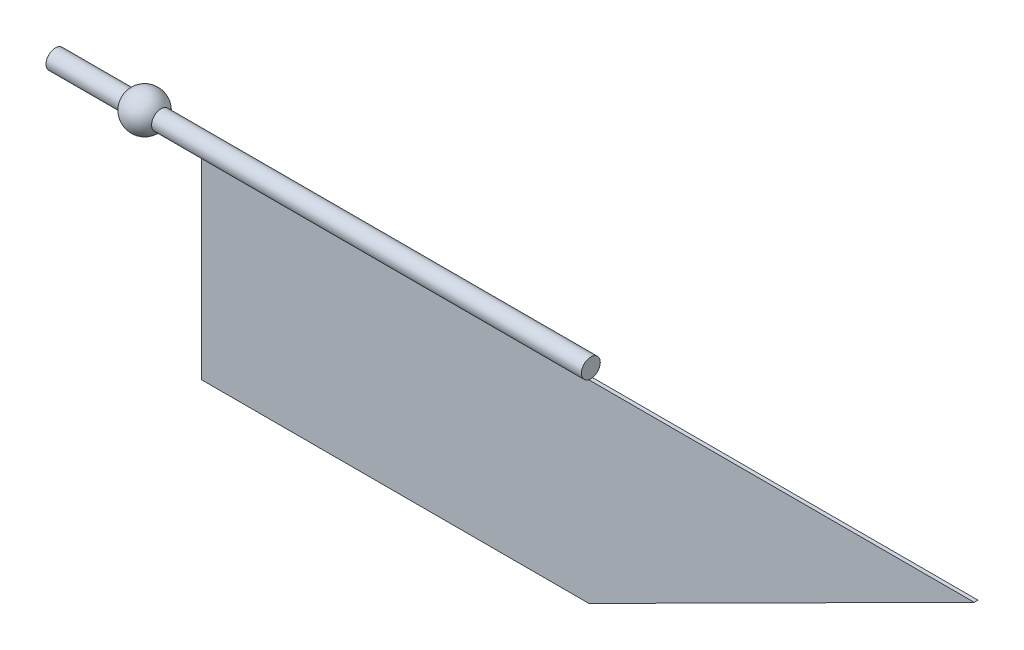
ISO-10303-21;
HEADER;
FILE_DESCRIPTION(('STEP AP214'),'2;1');
FILE_NAME('part.step','',(''),(''),'','','');
FILE_SCHEMA(('AUTOMOTIVE_DESIGN { 1 0 10303 214 1 1 1 1 }'));
ENDSEC;
DATA;
#1=APPLICATION_CONTEXT('core data for automotive mechanical design processes');
#2=APPLICATION_PROTOCOL_DEFINITION('international standard','automotive_design',2000,#1);
#3=PRODUCT_CONTEXT('',#1,'mechanical');
#4=PRODUCT('Part','Part','',(#3));
#5=PRODUCT_RELATED_PRODUCT_CATEGORY('part','',(#4));
#6=PRODUCT_DEFINITION_FORMATION('','',#4);
#7=PRODUCT_DEFINITION_CONTEXT('part definition',#1,'design');
#8=PRODUCT_DEFINITION('design','',#6,#7);
#9=PRODUCT_DEFINITION_SHAPE('','',#8);
#10=(LENGTH_UNIT() NAMED_UNIT(*) SI_UNIT(.MILLI.,.METRE.));
#11=(NAMED_UNIT(*) PLANE_ANGLE_UNIT() SI_UNIT($,.RADIAN.));
#12=(NAMED_UNIT(*) SI_UNIT($,.STERADIAN.) SOLID_ANGLE_UNIT());
#13=UNCERTAINTY_MEASURE_WITH_UNIT(LENGTH_MEASURE(1.E-05),#10,'distance_accuracy_value','');
#14=(GEOMETRIC_REPRESENTATION_CONTEXT(3) GLOBAL_UNCERTAINTY_ASSIGNED_CONTEXT((#13)) GLOBAL_UNIT_ASSIGNED_CONTEXT((#10,
#11,#12)) REPRESENTATION_CONTEXT('',''));
#15=CARTESIAN_POINT('',(0.,0.,0.));
#16=DIRECTION('',(0.,0.,1.));
#17=DIRECTION('',(1.,0.,0.));
#18=AXIS2_PLACEMENT_3D('',#15,#16,#17);
#19=CARTESIAN_POINT('',(12.4607692051384,-24.7953276156456,0.127));
#20=DIRECTION('',(-0.449031905592181,0.893515723286532,0.));
#21=DIRECTION('',(-0.893515723286532,-0.449031905592181,0.));
#22=AXIS2_PLACEMENT_3D('',#19,#20,#21);
#23=PLANE('',#22);
#24=DIRECTION('',(0.893515723286532,0.449031905592181,0.));
#25=VECTOR('',#24,1.);
#26=CARTESIAN_POINT('',(12.4607692051384,-24.7953276156456,-0.127));
#27=LINE('',#26,#25);
#28=CARTESIAN_POINT('',(35.9365149650358,-12.9977077427786,-0.127));
#29=VERTEX_POINT('',#28);
#30=CARTESIAN_POINT('',(61.8002811923816,0.,-0.127));
#31=VERTEX_POINT('',#30);
#32=EDGE_CURVE('E111',#29,#31,#27,.T.);
#33=ORIENTED_EDGE('',*,*,#32,.T.);
#34=DIRECTION('',(0.,0.,-1.));
#35=VECTOR('',#34,1.);
#36=CARTESIAN_POINT('',(61.8002811923816,0.,0.127));
#37=LINE('',#36,#35);
#38=CARTESIAN_POINT('',(61.8002811923816,0.,0.127));
#39=VERTEX_POINT('',#38);
#40=EDGE_CURVE('E12',#39,#31,#37,.T.);
#41=ORIENTED_EDGE('',*,*,#40,.F.);
#42=DIRECTION('',(0.893515723286532,0.449031905592181,0.));
#43=VECTOR('',#42,1.);
#44=CARTESIAN_POINT('',(12.4607692051384,-24.7953276156456,0.127));
#45=LINE('',#44,#43);
#46=CARTESIAN_POINT('',(35.9365149650358,-12.9977077427786,0.127));
#47=VERTEX_POINT('',#46);
#48=EDGE_CURVE('E105',#47,#39,#45,.T.);
#49=ORIENTED_EDGE('',*,*,#48,.F.);
#50=DIRECTION('',(0.,0.,-1.));
#51=VECTOR('',#50,1.);
#52=CARTESIAN_POINT('',(35.9365149650358,-12.9977077427786,0.127));
#53=LINE('',#52,#51);
#54=EDGE_CURVE('E109',#47,#29,#53,.T.);
#55=ORIENTED_EDGE('',*,*,#54,.T.);
#56=EDGE_LOOP('',(#33,#41,#49,#55));
#57=FACE_BOUND('',#56,.T.);
#58=ADVANCED_FACE('F51',(#57),#23,.F.);
#59=CARTESIAN_POINT('',(0.,0.,0.127));
#60=DIRECTION('',(0.,-1.,0.));
#61=DIRECTION('',(0.,0.,-1.));
#62=AXIS2_PLACEMENT_3D('',#59,#60,#61);
#63=PLANE('',#62);
#64=DIRECTION('',(-1.,0.,0.));
#65=VECTOR('',#64,1.);
#66=CARTESIAN_POINT('',(0.,0.,-0.127));
#67=LINE('',#66,#65);
#68=CARTESIAN_POINT('',(9.92121977920196,0.,-0.127));
#69=VERTEX_POINT('',#68);
#70=EDGE_CURVE('E106',#31,#69,#67,.T.);
#71=ORIENTED_EDGE('',*,*,#70,.T.);
#72=DIRECTION('',(0.,0.,-1.));
#73=VECTOR('',#72,1.);
#74=CARTESIAN_POINT('',(9.92121977920196,0.,0.127));
#75=LINE('',#74,#73);
#76=CARTESIAN_POINT('',(9.92121977920196,0.,0.127));
#77=VERTEX_POINT('',#76);
#78=EDGE_CURVE('E56',#77,#69,#75,.T.);
#79=ORIENTED_EDGE('',*,*,#78,.F.);
#80=DIRECTION('',(-1.,0.,0.));
#81=VECTOR('',#80,1.);
#82=CARTESIAN_POINT('',(0.,0.,0.127));
#83=LINE('',#82,#81);
#84=EDGE_CURVE('E100',#39,#77,#83,.T.);
#85=ORIENTED_EDGE('',*,*,#84,.F.);
#86=ORIENTED_EDGE('',*,*,#40,.T.);
#87=EDGE_LOOP('',(#71,#79,#85,#86));
#88=FACE_BOUND('',#87,.T.);
#89=ADVANCED_FACE('F104',(#88),#63,.F.);
#90=CARTESIAN_POINT('',(9.92121977920196,0.,0.127));
#91=DIRECTION('',(1.,0.,0.));
#92=DIRECTION('',(0.,0.,-1.));
#93=AXIS2_PLACEMENT_3D('',#90,#91,#92);
#94=PLANE('',#93);
#95=DIRECTION('',(0.,-1.,0.));
#96=VECTOR('',#95,1.);
#97=CARTESIAN_POINT('',(9.92121977920196,0.,-0.127));
#98=LINE('',#97,#96);
#99=CARTESIAN_POINT('',(9.92121977920196,-12.9977077427786,-0.127));
#100=VERTEX_POINT('',#99);
#101=EDGE_CURVE('E82',#69,#100,#98,.T.);
#102=ORIENTED_EDGE('',*,*,#101,.T.);
#103=DIRECTION('',(0.,0.,-1.));
#104=VECTOR('',#103,1.);
#105=CARTESIAN_POINT('',(9.92121977920196,-12.9977077427786,0.127));
#106=LINE('',#105,#104);
#107=CARTESIAN_POINT('',(9.92121977920196,-12.9977077427786,0.127));
#108=VERTEX_POINT('',#107);
#109=EDGE_CURVE('E110',#108,#100,#106,.T.);
#110=ORIENTED_EDGE('',*,*,#109,.F.);
#111=DIRECTION('',(0.,-1.,0.));
#112=VECTOR('',#111,1.);
#113=CARTESIAN_POINT('',(9.92121977920196,0.,0.127));
#114=LINE('',#113,#112);
#115=EDGE_CURVE('E99',#77,#108,#114,.T.);
#116=ORIENTED_EDGE('',*,*,#115,.F.);
#117=ORIENTED_EDGE('',*,*,#78,.T.);
#118=EDGE_LOOP('',(#102,#110,#116,#117));
#119=FACE_BOUND('',#118,.T.);
#120=ADVANCED_FACE('F107',(#119),#94,.F.);
#121=CARTESIAN_POINT('',(0.,-12.9977077427786,0.127));
#122=DIRECTION('',(0.,1.,0.));
#123=DIRECTION('',(0.,0.,1.));
#124=AXIS2_PLACEMENT_3D('',#121,#122,#123);
#125=PLANE('',#124);
#126=DIRECTION('',(1.,0.,0.));
#127=VECTOR('',#126,1.);
#128=CARTESIAN_POINT('',(0.,-12.9977077427786,-0.127));
#129=LINE('',#128,#127);
#130=EDGE_CURVE('E89',#100,#29,#129,.T.);
#131=ORIENTED_EDGE('',*,*,#130,.T.);
#132=ORIENTED_EDGE('',*,*,#54,.F.);
#133=DIRECTION('',(1.,0.,0.));
#134=VECTOR('',#133,1.);
#135=CARTESIAN_POINT('',(0.,-12.9977077427786,0.127));
#136=LINE('',#135,#134);
#137=EDGE_CURVE('E70',#108,#47,#136,.T.);
#138=ORIENTED_EDGE('',*,*,#137,.F.);
#139=ORIENTED_EDGE('',*,*,#109,.T.);
#140=EDGE_LOOP('',(#131,#132,#138,#139));
#141=FACE_BOUND('',#140,.T.);
#142=ADVANCED_FACE('F123',(#141),#125,.F.);
#143=CARTESIAN_POINT('',(0.,0.,0.127));
#144=DIRECTION('',(0.,0.,1.));
#145=DIRECTION('',(1.,0.,0.));
#146=AXIS2_PLACEMENT_3D('',#143,#144,#145);
#147=PLANE('',#146);
#148=ORIENTED_EDGE('',*,*,#48,.T.);
#149=ORIENTED_EDGE('',*,*,#84,.T.);
#150=ORIENTED_EDGE('',*,*,#115,.T.);
#151=ORIENTED_EDGE('',*,*,#137,.T.);
#152=EDGE_LOOP('',(#148,#149,#150,#151));
#153=FACE_BOUND('',#152,.T.);
#154=ADVANCED_FACE('F98',(#153),#147,.T.);
#155=CARTESIAN_POINT('',(0.,0.,-0.127));
#156=DIRECTION('',(0.,0.,1.));
#157=DIRECTION('',(1.,0.,0.));
#158=AXIS2_PLACEMENT_3D('',#155,#156,#157);
#159=PLANE('',#158);
#160=ORIENTED_EDGE('',*,*,#32,.F.);
#161=ORIENTED_EDGE('',*,*,#130,.F.);
#162=ORIENTED_EDGE('',*,*,#101,.F.);
#163=ORIENTED_EDGE('',*,*,#70,.F.);
#164=EDGE_LOOP('',(#160,#161,#162,#163));
#165=FACE_BOUND('',#164,.T.);
#166=ADVANCED_FACE('F122',(#165),#159,.F.);
#167=CLOSED_SHELL('',(#58,#89,#120,#142,#154,#166));
#168=MANIFOLD_SOLID_BREP('B2',#167);
#169=CARTESIAN_POINT('',(5.98668085653127,0.634999999999996,0.));
#170=DIRECTION('',(1.,0.,0.));
#171=DIRECTION('',(0.,-1.,0.));
#172=AXIS2_PLACEMENT_3D('',#169,#170,#171);
#173=SPHERICAL_SURFACE('',#172,1.27);
#174=CARTESIAN_POINT('',(4.88682859372503,0.634999999999996,0.));
#175=DIRECTION('',(1.,0.,0.));
#176=DIRECTION('',(0.,1.,0.));
#177=AXIS2_PLACEMENT_3D('',#174,#175,#176);
#178=CIRCLE('',#177,0.634999999999996);
#179=CARTESIAN_POINT('',(4.88682859372503,0.,0.));
#180=VERTEX_POINT('',#179);
#181=EDGE_CURVE('E196',#180,#180,#178,.T.);
#182=CARTESIAN_POINT('',(7.08653311933751,0.634999999999996,0.));
#183=DIRECTION('',(1.,0.,0.));
#184=DIRECTION('',(0.,1.,0.));
#185=AXIS2_PLACEMENT_3D('',#182,#183,#184);
#186=CIRCLE('',#185,0.634999999999996);
#187=CARTESIAN_POINT('',(7.08653311933751,0.,0.));
#188=VERTEX_POINT('',#187);
#189=EDGE_CURVE('E49',#188,#188,#186,.T.);
#190=CARTESIAN_POINT('',(4.88682859372503,0.,0.));
#191=CARTESIAN_POINT('',(4.90068098348725,-0.0239958265704566,0.));
#192=CARTESIAN_POINT('',(4.91532089867445,-0.0475367926717353,0.));
#193=CARTESIAN_POINT('',(4.94610799913962,-0.0936115991980544,0.));
#194=CARTESIAN_POINT('',(4.9622551844176,-0.116145439623095,0.));
#195=CARTESIAN_POINT('',(4.99598904430519,-0.160108590059057,0.));
#196=CARTESIAN_POINT('',(5.01357571891481,-0.181537900069978,0.));
#197=CARTESIAN_POINT('',(5.05011288315113,-0.223200470284199,0.));
#198=CARTESIAN_POINT('',(5.06906337277783,-0.2434337304875,0.));
#199=CARTESIAN_POINT('',(5.10824711607087,-0.282617493726334,0.));
#200=CARTESIAN_POINT('',(5.1284803697372,-0.301567996761867,0.));
#201=CARTESIAN_POINT('',(5.17014297297116,-0.338105114234739,0.));
#202=CARTESIAN_POINT('',(5.1915723225388,-0.355691728672077,0.));
#203=CARTESIAN_POINT('',(5.23553536084159,-0.389425755667665,0.));
#204=CARTESIAN_POINT('',(5.25806904957674,-0.405573168225913,0.));
#205=CARTESIAN_POINT('',(5.30414427161601,-0.436359647022557,0.));
#206=CARTESIAN_POINT('',(5.32768580492014,-0.450998713260952,0.));
#207=CARTESIAN_POINT('',(5.3756759081424,-0.478705812351528,0.));
#208=CARTESIAN_POINT('',(5.40012447806053,-0.49177384520371,0.));
#209=CARTESIAN_POINT('',(5.44982396184574,-0.516282918289325,0.));
#210=CARTESIAN_POINT('',(5.47507487571282,-0.527723958522758,0.));
#211=CARTESIAN_POINT('',(5.52627091914239,-0.548930054055918,0.));
#212=CARTESIAN_POINT('',(5.55221604870489,-0.558695109355645,0.));
#213=CARTESIAN_POINT('',(5.60468942248762,-0.576507419561931,0.));
#214=CARTESIAN_POINT('',(5.63121766670787,-0.584554674468489,0.));
#215=CARTESIAN_POINT('',(5.68474367179427,-0.598896924305752,0.));
#216=CARTESIAN_POINT('',(5.71174143266042,-0.605191919236456,0.));
#217=CARTESIAN_POINT('',(5.76609086248115,-0.616002692987757,0.));
#218=CARTESIAN_POINT('',(5.79344253143572,-0.620518471808354,0.));
#219=CARTESIAN_POINT('',(5.84838265338789,-0.627751476081132,0.));
#220=CARTESIAN_POINT('',(5.87597110638549,-0.630468701533313,0.));
#221=CARTESIAN_POINT('',(5.93126665843249,-0.634092963492749,0.));
#222=CARTESIAN_POINT('',(5.95897375748188,-0.635000000000004,0.));
#223=CARTESIAN_POINT('',(6.01438795558066,-0.635000000000004,0.));
#224=CARTESIAN_POINT('',(6.04209505463006,-0.634092963492749,0.));
#225=CARTESIAN_POINT('',(6.09739060667705,-0.630468701533313,0.));
#226=CARTESIAN_POINT('',(6.12497905967465,-0.627751476081132,0.));
#227=CARTESIAN_POINT('',(6.17991918162682,-0.620518471808354,0.));
#228=CARTESIAN_POINT('',(6.20727085058139,-0.616002692987757,0.));
#229=CARTESIAN_POINT('',(6.26162028040212,-0.605191919236456,0.));
#230=CARTESIAN_POINT('',(6.28861804126827,-0.598896924305751,0.));
#231=CARTESIAN_POINT('',(6.34214404635467,-0.584554674468489,0.));
#232=CARTESIAN_POINT('',(6.36867229057492,-0.57650741956193,0.));
#233=CARTESIAN_POINT('',(6.42114566435766,-0.558695109355644,0.));
#234=CARTESIAN_POINT('',(6.44709079392015,-0.548930054055917,0.));
#235=CARTESIAN_POINT('',(6.49828683734972,-0.527723958522757,0.));
#236=CARTESIAN_POINT('',(6.5235377512168,-0.516282918289324,0.));
#237=CARTESIAN_POINT('',(6.57323723500201,-0.491773845203709,0.));
#238=CARTESIAN_POINT('',(6.59768580492014,-0.478705812351527,0.));
#239=CARTESIAN_POINT('',(6.6456759081424,-0.450998713260951,0.));
#240=CARTESIAN_POINT('',(6.66921744144653,-0.436359647022556,0.));
#241=CARTESIAN_POINT('',(6.71529266348581,-0.405573168225912,0.));
#242=CARTESIAN_POINT('',(6.73782635222096,-0.389425755667663,0.));
#243=CARTESIAN_POINT('',(6.78178939052374,-0.355691728672076,0.));
#244=CARTESIAN_POINT('',(6.80321874009138,-0.338105114234738,0.));
#245=CARTESIAN_POINT('',(6.84488134332534,-0.301567996761866,0.));
#246=CARTESIAN_POINT('',(6.86511459699167,-0.282617493726332,0.));
#247=CARTESIAN_POINT('',(6.90429834028471,-0.243433730487498,0.));
#248=CARTESIAN_POINT('',(6.92324882991142,-0.223200470284198,0.));
#249=CARTESIAN_POINT('',(6.95978599414774,-0.181537900069976,0.));
#250=CARTESIAN_POINT('',(6.97737266875735,-0.160108590059055,0.));
#251=CARTESIAN_POINT('',(7.01110652864494,-0.116145439623093,0.));
#252=CARTESIAN_POINT('',(7.02725371392292,-0.0936115991980528,0.));
#253=CARTESIAN_POINT('',(7.05804081438809,-0.0475367926717337,0.));
#254=CARTESIAN_POINT('',(7.07268072957529,-0.0239958265704551,0.));
#255=CARTESIAN_POINT('',(7.08653311933751,0.,0.));
#256=B_SPLINE_CURVE_WITH_KNOTS('',3,(#190,#191,#192,#193,#194,#195,#196,#197,#198,#199,#200,
#201,#202,#203,#204,#205,#206,#207,#208,#209,#210,#211,#212,#213,#214,#215,#216,#217,#218,#219,
#220,#221,#222,#223,#224,#225,#226,#227,#228,#229,#230,#231,#232,#233,#234,#235,#236,#237,#238,
#239,#240,#241,#242,#243,#244,#245,#246,#247,#248,#249,#250,#251,#252,#253,#254,#255),
.UNSPECIFIED.,.F.,.F.,(4,2,2,2,2,2,2,2,2,2,2,2,2,2,2,2,2,2,2,2,2,2,2,2,2,2,2,2,2,2,2,2,4),(0.,
0.0831064703673118,0.166212940734624,0.249319411101935,0.332425881469247,0.415532351836559,
0.498638822203871,0.581745292571182,0.664851762938494,0.747958233305806,0.831064703673118,
0.914171174040429,0.997277644407741,1.08038411477505,1.16349058514237,1.24659705550968,
1.32970352587699,1.4128099962443,1.49591646661161,1.57902293697892,1.66212940734624,
1.74523587771355,1.82834234808086,1.91144881844817,1.99455528881548,2.0776617591828,
2.16076822955011,2.24387469991742,2.32698117028473,2.41008764065204,2.49319411101935,
2.57630058138667,2.65940705175398),.UNSPECIFIED.);
#257=EDGE_CURVE('BSEAM184',#180,#188,#256,.T.);
#258=ORIENTED_EDGE('',*,*,#181,.T.);
#259=ORIENTED_EDGE('',*,*,#189,.F.);
#260=ORIENTED_EDGE('',*,*,#257,.T.);
#261=ORIENTED_EDGE('',*,*,#257,.F.);
#262=EDGE_LOOP('',(#258,#260,#259,#261));
#263=FACE_BOUND('',#262,.T.);
#264=ADVANCED_FACE('F184',(#263),#173,.T.);
#265=CARTESIAN_POINT('',(35.9365149650358,0.635,0.));
#266=DIRECTION('',(1.,0.,0.));
#267=DIRECTION('',(0.,1.,0.));
#268=AXIS2_PLACEMENT_3D('',#265,#266,#267);
#269=CYLINDRICAL_SURFACE('',#268,0.634999999999998);
#270=CARTESIAN_POINT('',(35.9365149650358,0.635,0.));
#271=DIRECTION('',(1.,0.,0.));
#272=DIRECTION('',(0.,1.,0.));
#273=AXIS2_PLACEMENT_3D('',#270,#271,#272);
#274=CIRCLE('',#273,0.635);
#275=CARTESIAN_POINT('',(35.9365149650358,1.27,0.));
#276=VERTEX_POINT('',#275);
#277=EDGE_CURVE('E188',#276,#276,#274,.T.);
#278=ORIENTED_EDGE('',*,*,#277,.F.);
#279=EDGE_LOOP('',(#278));
#280=FACE_BOUND('',#279,.T.);
#281=ORIENTED_EDGE('',*,*,#189,.T.);
#282=EDGE_LOOP('',(#281));
#283=FACE_BOUND('',#282,.T.);
#284=ADVANCED_FACE('F217',(#280,#283),#269,.T.);
#285=CARTESIAN_POINT('',(35.9365149650358,0.,0.));
#286=DIRECTION('',(-1.,0.,0.));
#287=DIRECTION('',(0.,-1.,0.));
#288=AXIS2_PLACEMENT_3D('',#285,#286,#287);
#289=PLANE('',#288);
#290=ORIENTED_EDGE('',*,*,#277,.T.);
#291=EDGE_LOOP('',(#290));
#292=FACE_BOUND('',#291,.T.);
#293=ADVANCED_FACE('F212',(#292),#289,.F.);
#294=CARTESIAN_POINT('',(0.,0.,0.));
#295=DIRECTION('',(1.,0.,0.));
#296=DIRECTION('',(0.,1.,0.));
#297=AXIS2_PLACEMENT_3D('',#294,#295,#296);
#298=PLANE('',#297);
#299=CARTESIAN_POINT('',(0.,0.634999999999995,0.));
#300=DIRECTION('',(1.,0.,0.));
#301=DIRECTION('',(0.,1.,0.));
#302=AXIS2_PLACEMENT_3D('',#299,#300,#301);
#303=CIRCLE('',#302,0.634999999999995);
#304=CARTESIAN_POINT('',(0.,1.26999999999999,0.));
#305=VERTEX_POINT('',#304);
#306=EDGE_CURVE('E192',#305,#305,#303,.T.);
#307=ORIENTED_EDGE('',*,*,#306,.F.);
#308=EDGE_LOOP('',(#307));
#309=FACE_BOUND('',#308,.T.);
#310=ADVANCED_FACE('F207',(#309),#298,.F.);
#311=CARTESIAN_POINT('',(35.9365149650358,0.635,0.));
#312=DIRECTION('',(1.,0.,0.));
#313=DIRECTION('',(0.,1.,0.));
#314=AXIS2_PLACEMENT_3D('',#311,#312,#313);
#315=CYLINDRICAL_SURFACE('',#314,0.634999999999996);
#316=ORIENTED_EDGE('',*,*,#181,.F.);
#317=EDGE_LOOP('',(#316));
#318=FACE_BOUND('',#317,.T.);
#319=ORIENTED_EDGE('',*,*,#306,.T.);
#320=EDGE_LOOP('',(#319));
#321=FACE_BOUND('',#320,.T.);
#322=ADVANCED_FACE('F206',(#318,#321),#315,.T.);
#323=CLOSED_SHELL('',(#264,#284,#293,#310,#322));
#324=MANIFOLD_SOLID_BREP('B6',#323);
#325=ADVANCED_BREP_SHAPE_REPRESENTATION('',(#18,#168,#324),#14);
#326=SHAPE_DEFINITION_REPRESENTATION(#9,#325);
ENDSEC;
END-ISO-10303-21;
